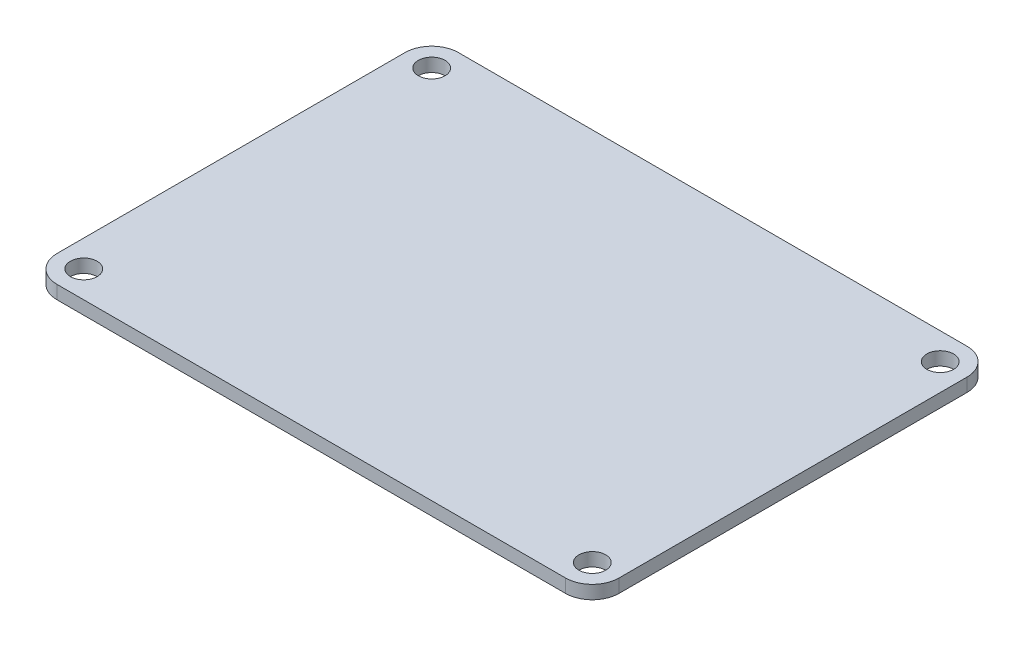
ISO-10303-21;
HEADER;
FILE_DESCRIPTION(('STEP AP214'),'2;1');
FILE_NAME('part.step','',(''),(''),'','','');
FILE_SCHEMA(('AUTOMOTIVE_DESIGN { 1 0 10303 214 1 1 1 1 }'));
ENDSEC;
DATA;
#1=APPLICATION_CONTEXT('core data for automotive mechanical design processes');
#2=APPLICATION_PROTOCOL_DEFINITION('international standard','automotive_design',2000,#1);
#3=PRODUCT_CONTEXT('',#1,'mechanical');
#4=PRODUCT('Part','Part','',(#3));
#5=PRODUCT_RELATED_PRODUCT_CATEGORY('part','',(#4));
#6=PRODUCT_DEFINITION_FORMATION('','',#4);
#7=PRODUCT_DEFINITION_CONTEXT('part definition',#1,'design');
#8=PRODUCT_DEFINITION('design','',#6,#7);
#9=PRODUCT_DEFINITION_SHAPE('','',#8);
#10=(LENGTH_UNIT() NAMED_UNIT(*) SI_UNIT(.MILLI.,.METRE.));
#11=(NAMED_UNIT(*) PLANE_ANGLE_UNIT() SI_UNIT($,.RADIAN.));
#12=(NAMED_UNIT(*) SI_UNIT($,.STERADIAN.) SOLID_ANGLE_UNIT());
#13=UNCERTAINTY_MEASURE_WITH_UNIT(LENGTH_MEASURE(1.E-05),#10,'distance_accuracy_value','');
#14=(GEOMETRIC_REPRESENTATION_CONTEXT(3) GLOBAL_UNCERTAINTY_ASSIGNED_CONTEXT((#13)) GLOBAL_UNIT_ASSIGNED_CONTEXT((#10,
#11,#12)) REPRESENTATION_CONTEXT('',''));
#15=CARTESIAN_POINT('',(0.,0.,0.));
#16=DIRECTION('',(0.,0.,1.));
#17=DIRECTION('',(1.,0.,0.));
#18=AXIS2_PLACEMENT_3D('',#15,#16,#17);
#19=CARTESIAN_POINT('',(-31.5,1.5,22.5));
#20=DIRECTION('',(1.,0.,0.));
#21=DIRECTION('',(0.,0.,-1.));
#22=AXIS2_PLACEMENT_3D('',#19,#20,#21);
#23=PLANE('',#22);
#24=DIRECTION('',(0.,0.,1.));
#25=VECTOR('',#24,1.);
#26=CARTESIAN_POINT('',(-31.5,0.,22.5));
#27=LINE('',#26,#25);
#28=CARTESIAN_POINT('',(-31.5,0.,-19.5));
#29=VERTEX_POINT('',#28);
#30=CARTESIAN_POINT('',(-31.5,0.,19.5));
#31=VERTEX_POINT('',#30);
#32=EDGE_CURVE('E126',#29,#31,#27,.T.);
#33=ORIENTED_EDGE('',*,*,#32,.T.);
#34=DIRECTION('',(0.,-1.,0.));
#35=VECTOR('',#34,1.);
#36=CARTESIAN_POINT('',(-31.5,1.5,19.5));
#37=LINE('',#36,#35);
#38=CARTESIAN_POINT('',(-31.5,1.5,19.5));
#39=VERTEX_POINT('',#38);
#40=EDGE_CURVE('E104',#31,#39,#37,.F.);
#41=ORIENTED_EDGE('',*,*,#40,.T.);
#42=DIRECTION('',(0.,0.,1.));
#43=VECTOR('',#42,1.);
#44=CARTESIAN_POINT('',(-31.5,1.5,22.5));
#45=LINE('',#44,#43);
#46=CARTESIAN_POINT('',(-31.5,1.5,-19.5));
#47=VERTEX_POINT('',#46);
#48=EDGE_CURVE('E136',#47,#39,#45,.T.);
#49=ORIENTED_EDGE('',*,*,#48,.F.);
#50=DIRECTION('',(0.,-1.,0.));
#51=VECTOR('',#50,1.);
#52=CARTESIAN_POINT('',(-31.5,1.5,-19.5));
#53=LINE('',#52,#51);
#54=EDGE_CURVE('E109',#47,#29,#53,.T.);
#55=ORIENTED_EDGE('',*,*,#54,.T.);
#56=EDGE_LOOP('',(#33,#41,#49,#55));
#57=FACE_BOUND('',#56,.T.);
#58=ADVANCED_FACE('F33',(#57),#23,.F.);
#59=CARTESIAN_POINT('',(31.5,1.5,22.5));
#60=DIRECTION('',(0.,0.,-1.));
#61=DIRECTION('',(-1.,0.,0.));
#62=AXIS2_PLACEMENT_3D('',#59,#60,#61);
#63=PLANE('',#62);
#64=DIRECTION('',(1.,0.,0.));
#65=VECTOR('',#64,1.);
#66=CARTESIAN_POINT('',(31.5,1.5,22.5));
#67=LINE('',#66,#65);
#68=CARTESIAN_POINT('',(-28.5,1.5,22.5));
#69=VERTEX_POINT('',#68);
#70=CARTESIAN_POINT('',(28.5,1.5,22.5));
#71=VERTEX_POINT('',#70);
#72=EDGE_CURVE('E119',#69,#71,#67,.T.);
#73=ORIENTED_EDGE('',*,*,#72,.F.);
#74=DIRECTION('',(0.,-1.,0.));
#75=VECTOR('',#74,1.);
#76=CARTESIAN_POINT('',(-28.5,1.5,22.5));
#77=LINE('',#76,#75);
#78=CARTESIAN_POINT('',(-28.5,0.,22.5));
#79=VERTEX_POINT('',#78);
#80=EDGE_CURVE('E103',#69,#79,#77,.T.);
#81=ORIENTED_EDGE('',*,*,#80,.T.);
#82=DIRECTION('',(1.,0.,0.));
#83=VECTOR('',#82,1.);
#84=CARTESIAN_POINT('',(31.5,0.,22.5));
#85=LINE('',#84,#83);
#86=CARTESIAN_POINT('',(28.5,0.,22.5));
#87=VERTEX_POINT('',#86);
#88=EDGE_CURVE('E116',#79,#87,#85,.T.);
#89=ORIENTED_EDGE('',*,*,#88,.T.);
#90=DIRECTION('',(0.,-1.,0.));
#91=VECTOR('',#90,1.);
#92=CARTESIAN_POINT('',(28.5,1.5,22.5));
#93=LINE('',#92,#91);
#94=EDGE_CURVE('E121',#87,#71,#93,.F.);
#95=ORIENTED_EDGE('',*,*,#94,.T.);
#96=EDGE_LOOP('',(#73,#81,#89,#95));
#97=FACE_BOUND('',#96,.T.);
#98=ADVANCED_FACE('F115',(#97),#63,.F.);
#99=CARTESIAN_POINT('',(31.5,1.5,22.5));
#100=DIRECTION('',(-1.,0.,0.));
#101=DIRECTION('',(0.,0.,1.));
#102=AXIS2_PLACEMENT_3D('',#99,#100,#101);
#103=PLANE('',#102);
#104=DIRECTION('',(0.,0.,-1.));
#105=VECTOR('',#104,1.);
#106=CARTESIAN_POINT('',(31.5,0.,22.5));
#107=LINE('',#106,#105);
#108=CARTESIAN_POINT('',(31.5,0.,19.5));
#109=VERTEX_POINT('',#108);
#110=CARTESIAN_POINT('',(31.5,0.,-19.5));
#111=VERTEX_POINT('',#110);
#112=EDGE_CURVE('E125',#109,#111,#107,.T.);
#113=ORIENTED_EDGE('',*,*,#112,.T.);
#114=DIRECTION('',(0.,-1.,0.));
#115=VECTOR('',#114,1.);
#116=CARTESIAN_POINT('',(31.5,1.5,-19.5));
#117=LINE('',#116,#115);
#118=CARTESIAN_POINT('',(31.5,1.5,-19.5));
#119=VERTEX_POINT('',#118);
#120=EDGE_CURVE('E11',#111,#119,#117,.F.);
#121=ORIENTED_EDGE('',*,*,#120,.T.);
#122=DIRECTION('',(0.,0.,-1.));
#123=VECTOR('',#122,1.);
#124=CARTESIAN_POINT('',(31.5,1.5,22.5));
#125=LINE('',#124,#123);
#126=CARTESIAN_POINT('',(31.5,1.5,19.5));
#127=VERTEX_POINT('',#126);
#128=EDGE_CURVE('E162',#127,#119,#125,.T.);
#129=ORIENTED_EDGE('',*,*,#128,.F.);
#130=DIRECTION('',(0.,-1.,0.));
#131=VECTOR('',#130,1.);
#132=CARTESIAN_POINT('',(31.5,1.5,19.5));
#133=LINE('',#132,#131);
#134=EDGE_CURVE('E41',#127,#109,#133,.T.);
#135=ORIENTED_EDGE('',*,*,#134,.T.);
#136=EDGE_LOOP('',(#113,#121,#129,#135));
#137=FACE_BOUND('',#136,.T.);
#138=ADVANCED_FACE('F160',(#137),#103,.F.);
#139=CARTESIAN_POINT('',(31.5,1.5,-22.5));
#140=DIRECTION('',(0.,0.,1.));
#141=DIRECTION('',(1.,0.,0.));
#142=AXIS2_PLACEMENT_3D('',#139,#140,#141);
#143=PLANE('',#142);
#144=DIRECTION('',(-1.,0.,0.));
#145=VECTOR('',#144,1.);
#146=CARTESIAN_POINT('',(31.5,0.,-22.5));
#147=LINE('',#146,#145);
#148=CARTESIAN_POINT('',(28.5,0.,-22.5));
#149=VERTEX_POINT('',#148);
#150=CARTESIAN_POINT('',(-28.5,0.,-22.5));
#151=VERTEX_POINT('',#150);
#152=EDGE_CURVE('E129',#149,#151,#147,.T.);
#153=ORIENTED_EDGE('',*,*,#152,.T.);
#154=DIRECTION('',(0.,-1.,0.));
#155=VECTOR('',#154,1.);
#156=CARTESIAN_POINT('',(-28.5,1.5,-22.5));
#157=LINE('',#156,#155);
#158=CARTESIAN_POINT('',(-28.5,1.5,-22.5));
#159=VERTEX_POINT('',#158);
#160=EDGE_CURVE('E48',#151,#159,#157,.F.);
#161=ORIENTED_EDGE('',*,*,#160,.T.);
#162=DIRECTION('',(-1.,0.,0.));
#163=VECTOR('',#162,1.);
#164=CARTESIAN_POINT('',(31.5,1.5,-22.5));
#165=LINE('',#164,#163);
#166=CARTESIAN_POINT('',(28.5,1.5,-22.5));
#167=VERTEX_POINT('',#166);
#168=EDGE_CURVE('E137',#167,#159,#165,.T.);
#169=ORIENTED_EDGE('',*,*,#168,.F.);
#170=DIRECTION('',(0.,-1.,0.));
#171=VECTOR('',#170,1.);
#172=CARTESIAN_POINT('',(28.5,1.5,-22.5));
#173=LINE('',#172,#171);
#174=EDGE_CURVE('E153',#167,#149,#173,.T.);
#175=ORIENTED_EDGE('',*,*,#174,.T.);
#176=EDGE_LOOP('',(#153,#161,#169,#175));
#177=FACE_BOUND('',#176,.T.);
#178=ADVANCED_FACE('F169',(#177),#143,.F.);
#179=CARTESIAN_POINT('',(0.,1.5,0.));
#180=DIRECTION('',(0.,1.,0.));
#181=DIRECTION('',(0.,0.,1.));
#182=AXIS2_PLACEMENT_3D('',#179,#180,#181);
#183=PLANE('',#182);
#184=CARTESIAN_POINT('',(28.5,1.5,-19.5));
#185=DIRECTION('',(0.,1.,0.));
#186=DIRECTION('',(0.,0.,1.));
#187=AXIS2_PLACEMENT_3D('',#184,#185,#186);
#188=CIRCLE('',#187,1.5);
#189=CARTESIAN_POINT('',(28.5,1.5,-18.));
#190=VERTEX_POINT('',#189);
#191=EDGE_CURVE('E194',#190,#190,#188,.T.);
#192=ORIENTED_EDGE('',*,*,#191,.F.);
#193=EDGE_LOOP('',(#192));
#194=FACE_BOUND('',#193,.T.);
#195=CARTESIAN_POINT('',(28.5,1.5,19.5));
#196=DIRECTION('',(0.,1.,0.));
#197=DIRECTION('',(0.,0.,1.));
#198=AXIS2_PLACEMENT_3D('',#195,#196,#197);
#199=CIRCLE('',#198,1.5);
#200=CARTESIAN_POINT('',(28.5,1.5,21.));
#201=VERTEX_POINT('',#200);
#202=EDGE_CURVE('E188',#201,#201,#199,.T.);
#203=ORIENTED_EDGE('',*,*,#202,.F.);
#204=EDGE_LOOP('',(#203));
#205=FACE_BOUND('',#204,.T.);
#206=CARTESIAN_POINT('',(-28.5,1.5,19.5));
#207=DIRECTION('',(0.,1.,0.));
#208=DIRECTION('',(0.,0.,1.));
#209=AXIS2_PLACEMENT_3D('',#206,#207,#208);
#210=CIRCLE('',#209,1.5);
#211=CARTESIAN_POINT('',(-28.5,1.5,21.));
#212=VERTEX_POINT('',#211);
#213=EDGE_CURVE('E182',#212,#212,#210,.T.);
#214=ORIENTED_EDGE('',*,*,#213,.F.);
#215=EDGE_LOOP('',(#214));
#216=FACE_BOUND('',#215,.T.);
#217=CARTESIAN_POINT('',(-28.5,1.5,-19.5));
#218=DIRECTION('',(0.,1.,0.));
#219=DIRECTION('',(0.,0.,1.));
#220=AXIS2_PLACEMENT_3D('',#217,#218,#219);
#221=CIRCLE('',#220,1.5);
#222=CARTESIAN_POINT('',(-28.5,1.5,-18.));
#223=VERTEX_POINT('',#222);
#224=EDGE_CURVE('E176',#223,#223,#221,.T.);
#225=ORIENTED_EDGE('',*,*,#224,.F.);
#226=EDGE_LOOP('',(#225));
#227=FACE_BOUND('',#226,.T.);
#228=ORIENTED_EDGE('',*,*,#48,.T.);
#229=CARTESIAN_POINT('',(-28.5,1.5,19.5));
#230=DIRECTION('',(0.,1.,0.));
#231=DIRECTION('',(0.,0.,1.));
#232=AXIS2_PLACEMENT_3D('',#229,#230,#231);
#233=CIRCLE('',#232,3.);
#234=EDGE_CURVE('E151',#39,#69,#233,.T.);
#235=ORIENTED_EDGE('',*,*,#234,.T.);
#236=ORIENTED_EDGE('',*,*,#72,.T.);
#237=CARTESIAN_POINT('',(28.5,1.5,19.5));
#238=DIRECTION('',(0.,1.,0.));
#239=DIRECTION('',(0.,0.,1.));
#240=AXIS2_PLACEMENT_3D('',#237,#238,#239);
#241=CIRCLE('',#240,3.);
#242=EDGE_CURVE('E146',#71,#127,#241,.T.);
#243=ORIENTED_EDGE('',*,*,#242,.T.);
#244=ORIENTED_EDGE('',*,*,#128,.T.);
#245=CARTESIAN_POINT('',(28.5,1.5,-19.5));
#246=DIRECTION('',(0.,1.,0.));
#247=DIRECTION('',(0.,0.,1.));
#248=AXIS2_PLACEMENT_3D('',#245,#246,#247);
#249=CIRCLE('',#248,3.);
#250=EDGE_CURVE('E55',#119,#167,#249,.T.);
#251=ORIENTED_EDGE('',*,*,#250,.T.);
#252=ORIENTED_EDGE('',*,*,#168,.T.);
#253=CARTESIAN_POINT('',(-28.5,1.5,-19.5));
#254=DIRECTION('',(0.,1.,0.));
#255=DIRECTION('',(0.,0.,1.));
#256=AXIS2_PLACEMENT_3D('',#253,#254,#255);
#257=CIRCLE('',#256,3.);
#258=EDGE_CURVE('E149',#159,#47,#257,.T.);
#259=ORIENTED_EDGE('',*,*,#258,.T.);
#260=EDGE_LOOP('',(#228,#235,#236,#243,#244,#251,#252,#259));
#261=FACE_BOUND('',#260,.T.);
#262=ADVANCED_FACE('F209',(#194,#205,#216,#227,#261),#183,.T.);
#263=CARTESIAN_POINT('',(0.,0.,0.));
#264=DIRECTION('',(0.,1.,0.));
#265=DIRECTION('',(0.,0.,1.));
#266=AXIS2_PLACEMENT_3D('',#263,#264,#265);
#267=PLANE('',#266);
#268=CARTESIAN_POINT('',(28.5,0.,-19.5));
#269=DIRECTION('',(0.,1.,0.));
#270=DIRECTION('',(0.,0.,1.));
#271=AXIS2_PLACEMENT_3D('',#268,#269,#270);
#272=CIRCLE('',#271,1.5);
#273=CARTESIAN_POINT('',(28.5,0.,-18.));
#274=VERTEX_POINT('',#273);
#275=EDGE_CURVE('E179',#274,#274,#272,.T.);
#276=ORIENTED_EDGE('',*,*,#275,.T.);
#277=EDGE_LOOP('',(#276));
#278=FACE_BOUND('',#277,.T.);
#279=CARTESIAN_POINT('',(28.5,0.,19.5));
#280=DIRECTION('',(0.,1.,0.));
#281=DIRECTION('',(0.,0.,1.));
#282=AXIS2_PLACEMENT_3D('',#279,#280,#281);
#283=CIRCLE('',#282,1.5);
#284=CARTESIAN_POINT('',(28.5,0.,21.));
#285=VERTEX_POINT('',#284);
#286=EDGE_CURVE('E191',#285,#285,#283,.T.);
#287=ORIENTED_EDGE('',*,*,#286,.T.);
#288=EDGE_LOOP('',(#287));
#289=FACE_BOUND('',#288,.T.);
#290=CARTESIAN_POINT('',(-28.5,0.,19.5));
#291=DIRECTION('',(0.,1.,0.));
#292=DIRECTION('',(0.,0.,1.));
#293=AXIS2_PLACEMENT_3D('',#290,#291,#292);
#294=CIRCLE('',#293,1.5);
#295=CARTESIAN_POINT('',(-28.5,0.,21.));
#296=VERTEX_POINT('',#295);
#297=EDGE_CURVE('E185',#296,#296,#294,.T.);
#298=ORIENTED_EDGE('',*,*,#297,.T.);
#299=EDGE_LOOP('',(#298));
#300=FACE_BOUND('',#299,.T.);
#301=CARTESIAN_POINT('',(-28.5,0.,-19.5));
#302=DIRECTION('',(0.,1.,0.));
#303=DIRECTION('',(0.,0.,1.));
#304=AXIS2_PLACEMENT_3D('',#301,#302,#303);
#305=CIRCLE('',#304,1.5);
#306=CARTESIAN_POINT('',(-28.5,0.,-18.));
#307=VERTEX_POINT('',#306);
#308=EDGE_CURVE('E131',#307,#307,#305,.T.);
#309=ORIENTED_EDGE('',*,*,#308,.T.);
#310=EDGE_LOOP('',(#309));
#311=FACE_BOUND('',#310,.T.);
#312=ORIENTED_EDGE('',*,*,#88,.F.);
#313=CARTESIAN_POINT('',(-28.5,0.,19.5));
#314=DIRECTION('',(0.,1.,0.));
#315=DIRECTION('',(0.,0.,1.));
#316=AXIS2_PLACEMENT_3D('',#313,#314,#315);
#317=CIRCLE('',#316,3.);
#318=EDGE_CURVE('E99',#79,#31,#317,.F.);
#319=ORIENTED_EDGE('',*,*,#318,.T.);
#320=ORIENTED_EDGE('',*,*,#32,.F.);
#321=CARTESIAN_POINT('',(-28.5,0.,-19.5));
#322=DIRECTION('',(0.,1.,0.));
#323=DIRECTION('',(0.,0.,1.));
#324=AXIS2_PLACEMENT_3D('',#321,#322,#323);
#325=CIRCLE('',#324,3.);
#326=EDGE_CURVE('E110',#29,#151,#325,.F.);
#327=ORIENTED_EDGE('',*,*,#326,.T.);
#328=ORIENTED_EDGE('',*,*,#152,.F.);
#329=CARTESIAN_POINT('',(28.5,0.,-19.5));
#330=DIRECTION('',(0.,1.,0.));
#331=DIRECTION('',(0.,0.,1.));
#332=AXIS2_PLACEMENT_3D('',#329,#330,#331);
#333=CIRCLE('',#332,3.);
#334=EDGE_CURVE('E140',#149,#111,#333,.F.);
#335=ORIENTED_EDGE('',*,*,#334,.T.);
#336=ORIENTED_EDGE('',*,*,#112,.F.);
#337=CARTESIAN_POINT('',(28.5,0.,19.5));
#338=DIRECTION('',(0.,1.,0.));
#339=DIRECTION('',(0.,0.,1.));
#340=AXIS2_PLACEMENT_3D('',#337,#338,#339);
#341=CIRCLE('',#340,3.);
#342=EDGE_CURVE('E120',#109,#87,#341,.F.);
#343=ORIENTED_EDGE('',*,*,#342,.T.);
#344=EDGE_LOOP('',(#312,#319,#320,#327,#328,#335,#336,#343));
#345=FACE_BOUND('',#344,.T.);
#346=ADVANCED_FACE('F123',(#278,#289,#300,#311,#345),#267,.F.);
#347=CARTESIAN_POINT('',(-28.5,1.5,19.5));
#348=DIRECTION('',(0.,-1.,0.));
#349=DIRECTION('',(0.,0.,-1.));
#350=AXIS2_PLACEMENT_3D('',#347,#348,#349);
#351=CYLINDRICAL_SURFACE('',#350,3.);
#352=ORIENTED_EDGE('',*,*,#234,.F.);
#353=ORIENTED_EDGE('',*,*,#40,.F.);
#354=ORIENTED_EDGE('',*,*,#318,.F.);
#355=ORIENTED_EDGE('',*,*,#80,.F.);
#356=EDGE_LOOP('',(#352,#353,#354,#355));
#357=FACE_BOUND('',#356,.T.);
#358=ADVANCED_FACE('F102',(#357),#351,.T.);
#359=CARTESIAN_POINT('',(-28.5,1.5,-19.5));
#360=DIRECTION('',(0.,-1.,0.));
#361=DIRECTION('',(0.,0.,-1.));
#362=AXIS2_PLACEMENT_3D('',#359,#360,#361);
#363=CYLINDRICAL_SURFACE('',#362,3.);
#364=ORIENTED_EDGE('',*,*,#258,.F.);
#365=ORIENTED_EDGE('',*,*,#160,.F.);
#366=ORIENTED_EDGE('',*,*,#326,.F.);
#367=ORIENTED_EDGE('',*,*,#54,.F.);
#368=EDGE_LOOP('',(#364,#365,#366,#367));
#369=FACE_BOUND('',#368,.T.);
#370=ADVANCED_FACE('F222',(#369),#363,.T.);
#371=CARTESIAN_POINT('',(28.5,1.5,-19.5));
#372=DIRECTION('',(0.,-1.,0.));
#373=DIRECTION('',(0.,0.,-1.));
#374=AXIS2_PLACEMENT_3D('',#371,#372,#373);
#375=CYLINDRICAL_SURFACE('',#374,3.);
#376=ORIENTED_EDGE('',*,*,#250,.F.);
#377=ORIENTED_EDGE('',*,*,#120,.F.);
#378=ORIENTED_EDGE('',*,*,#334,.F.);
#379=ORIENTED_EDGE('',*,*,#174,.F.);
#380=EDGE_LOOP('',(#376,#377,#378,#379));
#381=FACE_BOUND('',#380,.T.);
#382=ADVANCED_FACE('F168',(#381),#375,.T.);
#383=CARTESIAN_POINT('',(28.5,1.5,19.5));
#384=DIRECTION('',(0.,-1.,0.));
#385=DIRECTION('',(0.,0.,-1.));
#386=AXIS2_PLACEMENT_3D('',#383,#384,#385);
#387=CYLINDRICAL_SURFACE('',#386,3.);
#388=ORIENTED_EDGE('',*,*,#242,.F.);
#389=ORIENTED_EDGE('',*,*,#94,.F.);
#390=ORIENTED_EDGE('',*,*,#342,.F.);
#391=ORIENTED_EDGE('',*,*,#134,.F.);
#392=EDGE_LOOP('',(#388,#389,#390,#391));
#393=FACE_BOUND('',#392,.T.);
#394=ADVANCED_FACE('F35',(#393),#387,.T.);
#395=CARTESIAN_POINT('',(-28.5,0.,-19.5));
#396=DIRECTION('',(0.,1.,0.));
#397=DIRECTION('',(0.,0.,1.));
#398=AXIS2_PLACEMENT_3D('',#395,#396,#397);
#399=CYLINDRICAL_SURFACE('',#398,1.5);
#400=ORIENTED_EDGE('',*,*,#308,.F.);
#401=EDGE_LOOP('',(#400));
#402=FACE_BOUND('',#401,.T.);
#403=ORIENTED_EDGE('',*,*,#224,.T.);
#404=EDGE_LOOP('',(#403));
#405=FACE_BOUND('',#404,.T.);
#406=ADVANCED_FACE('F243',(#402,#405),#399,.F.);
#407=CARTESIAN_POINT('',(-28.5,0.,19.5));
#408=DIRECTION('',(0.,1.,0.));
#409=DIRECTION('',(0.,0.,1.));
#410=AXIS2_PLACEMENT_3D('',#407,#408,#409);
#411=CYLINDRICAL_SURFACE('',#410,1.5);
#412=ORIENTED_EDGE('',*,*,#297,.F.);
#413=EDGE_LOOP('',(#412));
#414=FACE_BOUND('',#413,.T.);
#415=ORIENTED_EDGE('',*,*,#213,.T.);
#416=EDGE_LOOP('',(#415));
#417=FACE_BOUND('',#416,.T.);
#418=ADVANCED_FACE('F246',(#414,#417),#411,.F.);
#419=CARTESIAN_POINT('',(28.5,0.,19.5));
#420=DIRECTION('',(0.,1.,0.));
#421=DIRECTION('',(0.,0.,1.));
#422=AXIS2_PLACEMENT_3D('',#419,#420,#421);
#423=CYLINDRICAL_SURFACE('',#422,1.5);
#424=ORIENTED_EDGE('',*,*,#286,.F.);
#425=EDGE_LOOP('',(#424));
#426=FACE_BOUND('',#425,.T.);
#427=ORIENTED_EDGE('',*,*,#202,.T.);
#428=EDGE_LOOP('',(#427));
#429=FACE_BOUND('',#428,.T.);
#430=ADVANCED_FACE('F205',(#426,#429),#423,.F.);
#431=CARTESIAN_POINT('',(28.5,0.,-19.5));
#432=DIRECTION('',(0.,1.,0.));
#433=DIRECTION('',(0.,0.,1.));
#434=AXIS2_PLACEMENT_3D('',#431,#432,#433);
#435=CYLINDRICAL_SURFACE('',#434,1.5);
#436=ORIENTED_EDGE('',*,*,#275,.F.);
#437=EDGE_LOOP('',(#436));
#438=FACE_BOUND('',#437,.T.);
#439=ORIENTED_EDGE('',*,*,#191,.T.);
#440=EDGE_LOOP('',(#439));
#441=FACE_BOUND('',#440,.T.);
#442=ADVANCED_FACE('F202',(#438,#441),#435,.F.);
#443=CLOSED_SHELL('',(#58,#98,#138,#178,#262,#346,#358,#370,#382,#394,#406,#418,#430,#442));
#444=MANIFOLD_SOLID_BREP('B2',#443);
#445=ADVANCED_BREP_SHAPE_REPRESENTATION('',(#18,#444),#14);
#446=SHAPE_DEFINITION_REPRESENTATION(#9,#445);
ENDSEC;
END-ISO-10303-21;
